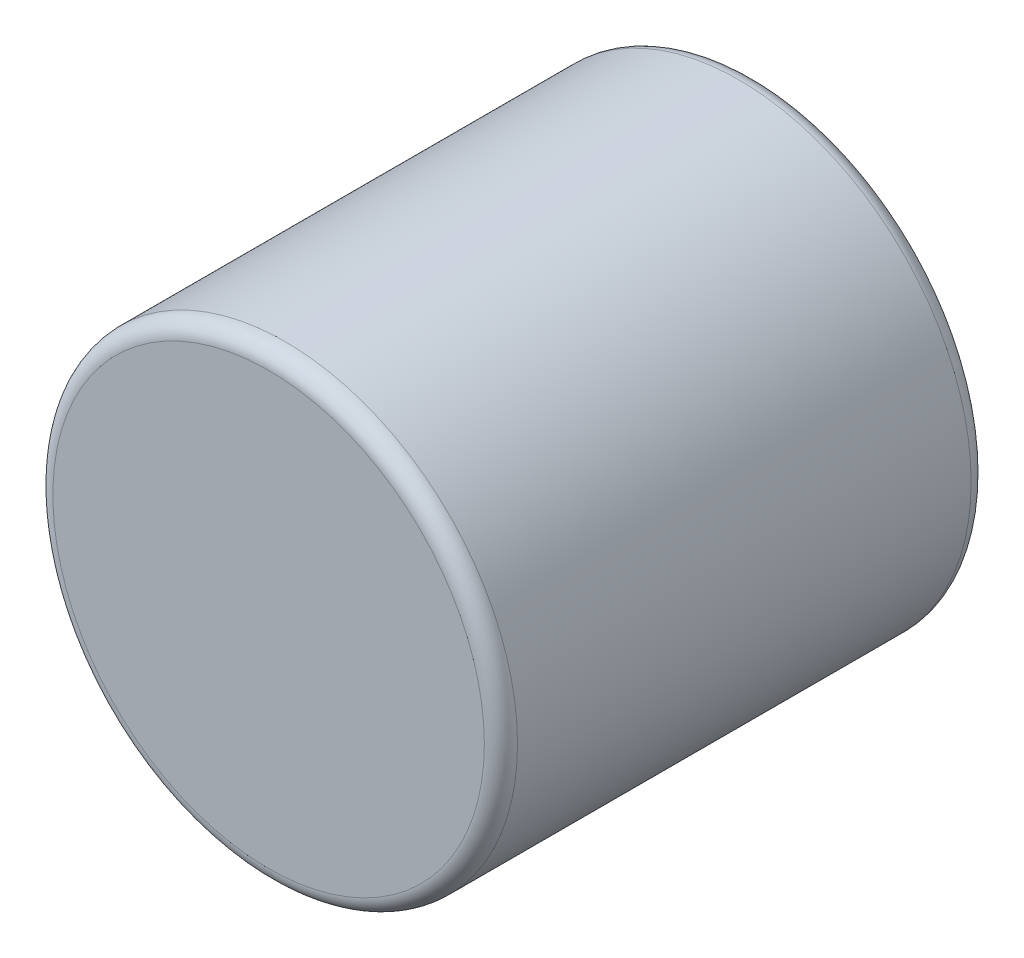
ISO-10303-21;
HEADER;
FILE_DESCRIPTION(('STEP AP214'),'2;1');
FILE_NAME('part.step','',(''),(''),'','','');
FILE_SCHEMA(('AUTOMOTIVE_DESIGN { 1 0 10303 214 1 1 1 1 }'));
ENDSEC;
DATA;
#1=APPLICATION_CONTEXT('core data for automotive mechanical design processes');
#2=APPLICATION_PROTOCOL_DEFINITION('international standard','automotive_design',2000,#1);
#3=PRODUCT_CONTEXT('',#1,'mechanical');
#4=PRODUCT('Part','Part','',(#3));
#5=PRODUCT_RELATED_PRODUCT_CATEGORY('part','',(#4));
#6=PRODUCT_DEFINITION_FORMATION('','',#4);
#7=PRODUCT_DEFINITION_CONTEXT('part definition',#1,'design');
#8=PRODUCT_DEFINITION('design','',#6,#7);
#9=PRODUCT_DEFINITION_SHAPE('','',#8);
#10=(LENGTH_UNIT() NAMED_UNIT(*) SI_UNIT(.MILLI.,.METRE.));
#11=(NAMED_UNIT(*) PLANE_ANGLE_UNIT() SI_UNIT($,.RADIAN.));
#12=(NAMED_UNIT(*) SI_UNIT($,.STERADIAN.) SOLID_ANGLE_UNIT());
#13=UNCERTAINTY_MEASURE_WITH_UNIT(LENGTH_MEASURE(1.E-05),#10,'distance_accuracy_value','');
#14=(GEOMETRIC_REPRESENTATION_CONTEXT(3) GLOBAL_UNCERTAINTY_ASSIGNED_CONTEXT((#13)) GLOBAL_UNIT_ASSIGNED_CONTEXT((#10,
#11,#12)) REPRESENTATION_CONTEXT('',''));
#15=CARTESIAN_POINT('',(0.,0.,0.));
#16=DIRECTION('',(0.,0.,1.));
#17=DIRECTION('',(1.,0.,0.));
#18=AXIS2_PLACEMENT_3D('',#15,#16,#17);
#19=CARTESIAN_POINT('',(0.,0.,5.5));
#20=DIRECTION('',(0.,0.,1.));
#21=DIRECTION('',(1.,0.,0.));
#22=AXIS2_PLACEMENT_3D('',#19,#20,#21);
#23=PLANE('',#22);
#24=CARTESIAN_POINT('',(0.,0.,5.5));
#25=DIRECTION('',(0.,0.,-1.));
#26=DIRECTION('',(1.,0.,0.));
#27=AXIS2_PLACEMENT_3D('',#24,#25,#26);
#28=CIRCLE('',#27,1.95);
#29=CARTESIAN_POINT('',(1.95,0.,5.5));
#30=VERTEX_POINT('',#29);
#31=EDGE_CURVE('E62',#30,#30,#28,.T.);
#32=ORIENTED_EDGE('',*,*,#31,.F.);
#33=EDGE_LOOP('',(#32));
#34=FACE_BOUND('',#33,.T.);
#35=ADVANCED_FACE('F15',(#34),#23,.T.);
#36=CARTESIAN_POINT('',(0.,0.,1.1));
#37=DIRECTION('',(0.,0.,1.));
#38=DIRECTION('',(1.,0.,0.));
#39=AXIS2_PLACEMENT_3D('',#36,#37,#38);
#40=PLANE('',#39);
#41=CARTESIAN_POINT('',(0.,0.,1.1));
#42=DIRECTION('',(0.,0.,1.));
#43=DIRECTION('',(1.,0.,0.));
#44=AXIS2_PLACEMENT_3D('',#41,#42,#43);
#45=CIRCLE('',#44,1.95);
#46=CARTESIAN_POINT('',(1.95,0.,1.1));
#47=VERTEX_POINT('',#46);
#48=EDGE_CURVE('E30',#47,#47,#45,.T.);
#49=ORIENTED_EDGE('',*,*,#48,.F.);
#50=EDGE_LOOP('',(#49));
#51=FACE_BOUND('',#50,.T.);
#52=ADVANCED_FACE('F74',(#51),#40,.F.);
#53=CARTESIAN_POINT('',(0.,0.,5.35));
#54=DIRECTION('',(0.,0.,1.));
#55=DIRECTION('',(1.,0.,0.));
#56=AXIS2_PLACEMENT_3D('',#53,#54,#55);
#57=TOROIDAL_SURFACE('',#56,1.95,0.15);
#58=CARTESIAN_POINT('',(0.,0.,5.35));
#59=DIRECTION('',(0.,0.,1.));
#60=DIRECTION('',(1.,0.,0.));
#61=AXIS2_PLACEMENT_3D('',#58,#59,#60);
#62=CIRCLE('',#61,2.1);
#63=CARTESIAN_POINT('',(2.1,0.,5.35));
#64=VERTEX_POINT('',#63);
#65=EDGE_CURVE('E25',#64,#64,#62,.F.);
#66=ORIENTED_EDGE('',*,*,#65,.F.);
#67=EDGE_LOOP('',(#66));
#68=FACE_BOUND('',#67,.T.);
#69=ORIENTED_EDGE('',*,*,#31,.T.);
#70=EDGE_LOOP('',(#69));
#71=FACE_BOUND('',#70,.T.);
#72=ADVANCED_FACE('F43',(#68,#71),#57,.T.);
#73=CARTESIAN_POINT('',(0.,0.,1.25));
#74=DIRECTION('',(0.,0.,-1.));
#75=DIRECTION('',(1.,0.,0.));
#76=AXIS2_PLACEMENT_3D('',#73,#74,#75);
#77=TOROIDAL_SURFACE('',#76,1.95,0.15);
#78=CARTESIAN_POINT('',(0.,0.,1.25));
#79=DIRECTION('',(0.,0.,1.));
#80=DIRECTION('',(1.,0.,0.));
#81=AXIS2_PLACEMENT_3D('',#78,#79,#80);
#82=CIRCLE('',#81,2.1);
#83=CARTESIAN_POINT('',(2.1,0.,1.25));
#84=VERTEX_POINT('',#83);
#85=EDGE_CURVE('E10',#84,#84,#82,.T.);
#86=ORIENTED_EDGE('',*,*,#85,.F.);
#87=EDGE_LOOP('',(#86));
#88=FACE_BOUND('',#87,.T.);
#89=ORIENTED_EDGE('',*,*,#48,.T.);
#90=EDGE_LOOP('',(#89));
#91=FACE_BOUND('',#90,.T.);
#92=ADVANCED_FACE('F38',(#88,#91),#77,.T.);
#93=CARTESIAN_POINT('',(0.,0.,1.1));
#94=DIRECTION('',(0.,0.,1.));
#95=DIRECTION('',(1.,0.,0.));
#96=AXIS2_PLACEMENT_3D('',#93,#94,#95);
#97=CYLINDRICAL_SURFACE('',#96,2.1);
#98=ORIENTED_EDGE('',*,*,#65,.T.);
#99=EDGE_LOOP('',(#98));
#100=FACE_BOUND('',#99,.T.);
#101=ORIENTED_EDGE('',*,*,#85,.T.);
#102=EDGE_LOOP('',(#101));
#103=FACE_BOUND('',#102,.T.);
#104=ADVANCED_FACE('F42',(#100,#103),#97,.T.);
#105=CLOSED_SHELL('',(#35,#52,#72,#92,#104));
#106=MANIFOLD_SOLID_BREP('B1',#105);
#107=ADVANCED_BREP_SHAPE_REPRESENTATION('',(#18,#106),#14);
#108=SHAPE_DEFINITION_REPRESENTATION(#9,#107);
ENDSEC;
END-ISO-10303-21;
